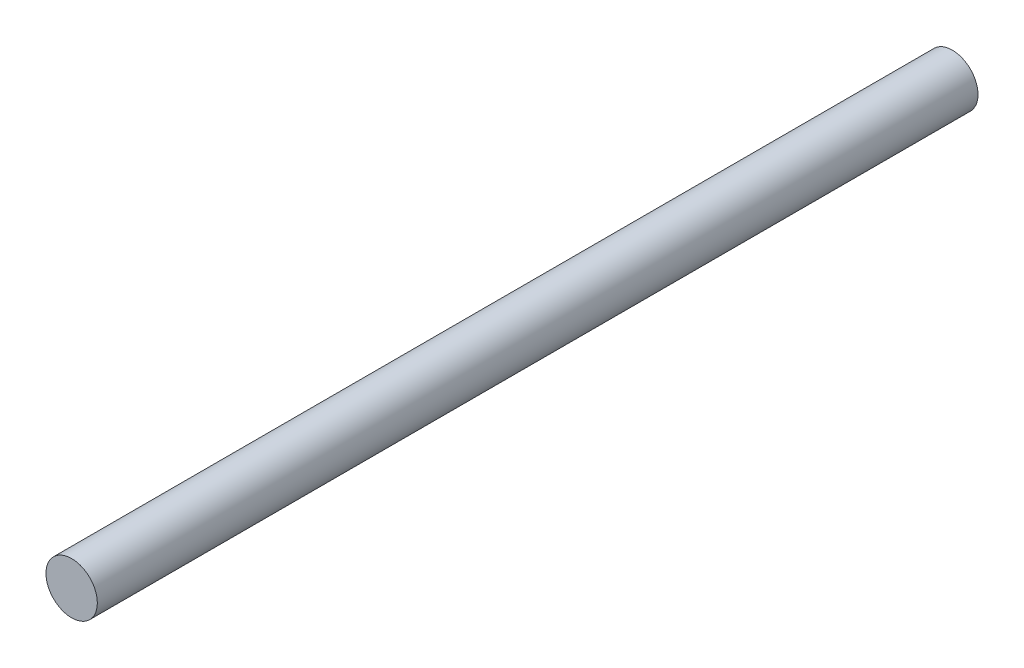
ISO-10303-21;
HEADER;
FILE_DESCRIPTION(('STEP AP214'),'2;1');
FILE_NAME('part.step','',(''),(''),'','','');
FILE_SCHEMA(('AUTOMOTIVE_DESIGN { 1 0 10303 214 1 1 1 1 }'));
ENDSEC;
DATA;
#1=APPLICATION_CONTEXT('core data for automotive mechanical design processes');
#2=APPLICATION_PROTOCOL_DEFINITION('international standard','automotive_design',2000,#1);
#3=PRODUCT_CONTEXT('',#1,'mechanical');
#4=PRODUCT('Part','Part','',(#3));
#5=PRODUCT_RELATED_PRODUCT_CATEGORY('part','',(#4));
#6=PRODUCT_DEFINITION_FORMATION('','',#4);
#7=PRODUCT_DEFINITION_CONTEXT('part definition',#1,'design');
#8=PRODUCT_DEFINITION('design','',#6,#7);
#9=PRODUCT_DEFINITION_SHAPE('','',#8);
#10=(LENGTH_UNIT() NAMED_UNIT(*) SI_UNIT(.MILLI.,.METRE.));
#11=(NAMED_UNIT(*) PLANE_ANGLE_UNIT() SI_UNIT($,.RADIAN.));
#12=(NAMED_UNIT(*) SI_UNIT($,.STERADIAN.) SOLID_ANGLE_UNIT());
#13=UNCERTAINTY_MEASURE_WITH_UNIT(LENGTH_MEASURE(1.E-05),#10,'distance_accuracy_value','');
#14=(GEOMETRIC_REPRESENTATION_CONTEXT(3) GLOBAL_UNCERTAINTY_ASSIGNED_CONTEXT((#13)) GLOBAL_UNIT_ASSIGNED_CONTEXT((#10,
#11,#12)) REPRESENTATION_CONTEXT('',''));
#15=CARTESIAN_POINT('',(0.,0.,0.));
#16=DIRECTION('',(0.,0.,1.));
#17=DIRECTION('',(1.,0.,0.));
#18=AXIS2_PLACEMENT_3D('',#15,#16,#17);
#19=CARTESIAN_POINT('',(0.,0.,120.));
#20=DIRECTION('',(0.,0.,-1.));
#21=DIRECTION('',(-1.,0.,0.));
#22=AXIS2_PLACEMENT_3D('',#19,#20,#21);
#23=CYLINDRICAL_SURFACE('',#22,3.5);
#24=CARTESIAN_POINT('',(0.,0.,120.));
#25=DIRECTION('',(0.,0.,1.));
#26=DIRECTION('',(1.,0.,0.));
#27=AXIS2_PLACEMENT_3D('',#24,#25,#26);
#28=CIRCLE('',#27,3.5);
#29=CARTESIAN_POINT('',(3.5,0.,120.));
#30=VERTEX_POINT('',#29);
#31=EDGE_CURVE('E10',#30,#30,#28,.T.);
#32=ORIENTED_EDGE('',*,*,#31,.F.);
#33=EDGE_LOOP('',(#32));
#34=FACE_BOUND('',#33,.T.);
#35=CARTESIAN_POINT('',(0.,0.,0.));
#36=DIRECTION('',(0.,0.,1.));
#37=DIRECTION('',(1.,0.,0.));
#38=AXIS2_PLACEMENT_3D('',#35,#36,#37);
#39=CIRCLE('',#38,3.5);
#40=CARTESIAN_POINT('',(3.5,0.,0.));
#41=VERTEX_POINT('',#40);
#42=EDGE_CURVE('E34',#41,#41,#39,.T.);
#43=ORIENTED_EDGE('',*,*,#42,.T.);
#44=EDGE_LOOP('',(#43));
#45=FACE_BOUND('',#44,.T.);
#46=ADVANCED_FACE('F31',(#34,#45),#23,.T.);
#47=CARTESIAN_POINT('',(0.,0.,120.));
#48=DIRECTION('',(0.,0.,1.));
#49=DIRECTION('',(1.,0.,0.));
#50=AXIS2_PLACEMENT_3D('',#47,#48,#49);
#51=PLANE('',#50);
#52=ORIENTED_EDGE('',*,*,#31,.T.);
#53=EDGE_LOOP('',(#52));
#54=FACE_BOUND('',#53,.T.);
#55=ADVANCED_FACE('F46',(#54),#51,.T.);
#56=CARTESIAN_POINT('',(0.,0.,0.));
#57=DIRECTION('',(0.,0.,1.));
#58=DIRECTION('',(1.,0.,0.));
#59=AXIS2_PLACEMENT_3D('',#56,#57,#58);
#60=PLANE('',#59);
#61=ORIENTED_EDGE('',*,*,#42,.F.);
#62=EDGE_LOOP('',(#61));
#63=FACE_BOUND('',#62,.T.);
#64=ADVANCED_FACE('F44',(#63),#60,.F.);
#65=CLOSED_SHELL('',(#46,#55,#64));
#66=MANIFOLD_SOLID_BREP('B2',#65);
#67=ADVANCED_BREP_SHAPE_REPRESENTATION('',(#18,#66),#14);
#68=SHAPE_DEFINITION_REPRESENTATION(#9,#67);
ENDSEC;
END-ISO-10303-21;
